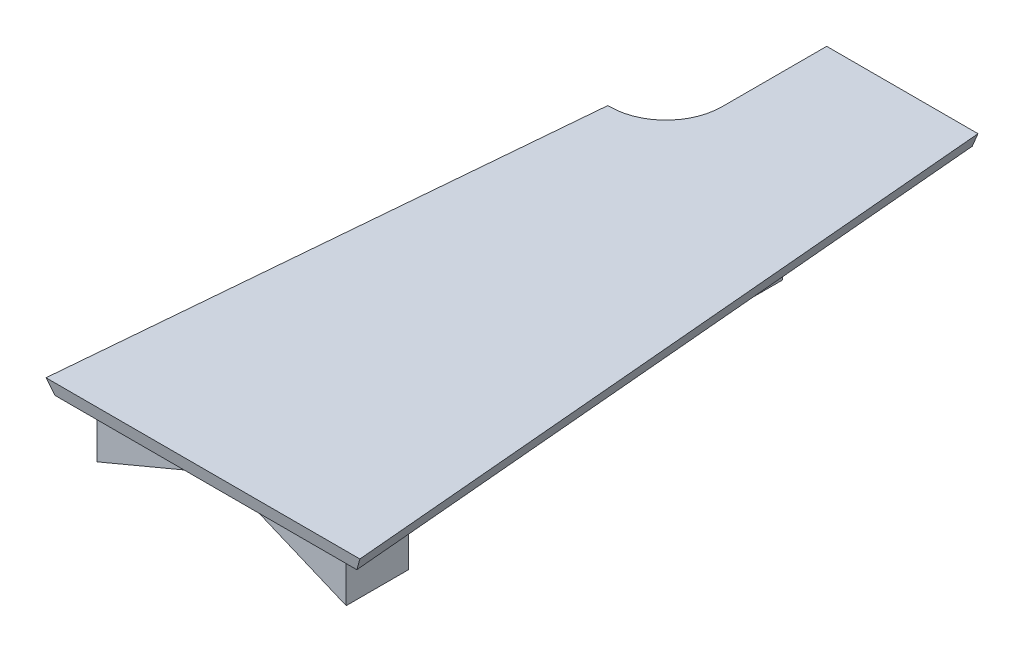
ISO-10303-21;
HEADER;
FILE_DESCRIPTION(('STEP AP214'),'2;1');
FILE_NAME('part.step','',(''),(''),'','','');
FILE_SCHEMA(('AUTOMOTIVE_DESIGN { 1 0 10303 214 1 1 1 1 }'));
ENDSEC;
DATA;
#1=APPLICATION_CONTEXT('core data for automotive mechanical design processes');
#2=APPLICATION_PROTOCOL_DEFINITION('international standard','automotive_design',2000,#1);
#3=PRODUCT_CONTEXT('',#1,'mechanical');
#4=PRODUCT('Part','Part','',(#3));
#5=PRODUCT_RELATED_PRODUCT_CATEGORY('part','',(#4));
#6=PRODUCT_DEFINITION_FORMATION('','',#4);
#7=PRODUCT_DEFINITION_CONTEXT('part definition',#1,'design');
#8=PRODUCT_DEFINITION('design','',#6,#7);
#9=PRODUCT_DEFINITION_SHAPE('','',#8);
#10=(LENGTH_UNIT() NAMED_UNIT(*) SI_UNIT(.MILLI.,.METRE.));
#11=(NAMED_UNIT(*) PLANE_ANGLE_UNIT() SI_UNIT($,.RADIAN.));
#12=(NAMED_UNIT(*) SI_UNIT($,.STERADIAN.) SOLID_ANGLE_UNIT());
#13=UNCERTAINTY_MEASURE_WITH_UNIT(LENGTH_MEASURE(1.E-05),#10,'distance_accuracy_value','');
#14=(GEOMETRIC_REPRESENTATION_CONTEXT(3) GLOBAL_UNCERTAINTY_ASSIGNED_CONTEXT((#13)) GLOBAL_UNIT_ASSIGNED_CONTEXT((#10,
#11,#12)) REPRESENTATION_CONTEXT('',''));
#15=CARTESIAN_POINT('',(0.,0.,0.));
#16=DIRECTION('',(0.,0.,1.));
#17=DIRECTION('',(1.,0.,0.));
#18=AXIS2_PLACEMENT_3D('',#15,#16,#17);
#19=CARTESIAN_POINT('',(18.0118217823983,-5.,-25.7361816822361));
#20=DIRECTION('',(0.,0.,1.));
#21=DIRECTION('',(1.,0.,0.));
#22=AXIS2_PLACEMENT_3D('',#19,#20,#21);
#23=PLANE('',#22);
#24=DIRECTION('',(0.,1.,0.));
#25=VECTOR('',#24,1.);
#26=CARTESIAN_POINT('',(18.0118217823983,-5.,-25.7361816822361));
#27=LINE('',#26,#25);
#28=CARTESIAN_POINT('',(18.0118217823983,-2.5,-25.7361816822361));
#29=VERTEX_POINT('',#28);
#30=CARTESIAN_POINT('',(18.0118217823983,0.,-25.7361816822361));
#31=VERTEX_POINT('',#30);
#32=EDGE_CURVE('E243',#29,#31,#27,.T.);
#33=ORIENTED_EDGE('',*,*,#32,.F.);
#34=DIRECTION('',(0.974370064785236,-0.224951054343862,0.));
#35=VECTOR('',#34,1.);
#36=CARTESIAN_POINT('',(18.0118217823983,-2.5,-25.7361816822361));
#37=LINE('',#36,#35);
#38=CARTESIAN_POINT('',(7.18313209668774,0.,-25.7361816822361));
#39=VERTEX_POINT('',#38);
#40=EDGE_CURVE('E382',#39,#29,#37,.T.);
#41=ORIENTED_EDGE('',*,*,#40,.F.);
#42=DIRECTION('',(1.,0.,0.));
#43=VECTOR('',#42,1.);
#44=CARTESIAN_POINT('',(18.0118217823983,0.,-25.7361816822361));
#45=LINE('',#44,#43);
#46=EDGE_CURVE('E399',#39,#31,#45,.T.);
#47=ORIENTED_EDGE('',*,*,#46,.T.);
#48=EDGE_LOOP('',(#33,#41,#47));
#49=FACE_BOUND('',#48,.T.);
#50=ADVANCED_FACE('F46',(#49),#23,.F.);
#51=CARTESIAN_POINT('',(18.0118217823983,-5.,-15.2638183177639));
#52=DIRECTION('',(0.,0.,-1.));
#53=DIRECTION('',(-1.,0.,0.));
#54=AXIS2_PLACEMENT_3D('',#51,#52,#53);
#55=PLANE('',#54);
#56=DIRECTION('',(-1.,0.,0.));
#57=VECTOR('',#56,1.);
#58=CARTESIAN_POINT('',(18.0118217823983,0.,-15.2638183177639));
#59=LINE('',#58,#57);
#60=CARTESIAN_POINT('',(18.0118217823983,0.,-15.2638183177639));
#61=VERTEX_POINT('',#60);
#62=CARTESIAN_POINT('',(7.18313209668774,0.,-15.2638183177639));
#63=VERTEX_POINT('',#62);
#64=EDGE_CURVE('E231',#61,#63,#59,.T.);
#65=ORIENTED_EDGE('',*,*,#64,.T.);
#66=DIRECTION('',(0.974370064785236,-0.224951054343862,0.));
#67=VECTOR('',#66,1.);
#68=CARTESIAN_POINT('',(18.5597857158846,-2.62650744212604,-15.2638183177639));
#69=LINE('',#68,#67);
#70=CARTESIAN_POINT('',(18.0118217823983,-2.5,-15.2638183177639));
#71=VERTEX_POINT('',#70);
#72=EDGE_CURVE('E177',#63,#71,#69,.T.);
#73=ORIENTED_EDGE('',*,*,#72,.T.);
#74=DIRECTION('',(0.,1.,0.));
#75=VECTOR('',#74,1.);
#76=CARTESIAN_POINT('',(18.0118217823983,-5.,-15.2638183177639));
#77=LINE('',#76,#75);
#78=EDGE_CURVE('E228',#71,#61,#77,.T.);
#79=ORIENTED_EDGE('',*,*,#78,.T.);
#80=EDGE_LOOP('',(#65,#73,#79));
#81=FACE_BOUND('',#80,.T.);
#82=ADVANCED_FACE('F227',(#81),#55,.F.);
#83=CARTESIAN_POINT('',(0.,0.,0.));
#84=DIRECTION('',(0.,-1.,0.));
#85=DIRECTION('',(0.,0.,-1.));
#86=AXIS2_PLACEMENT_3D('',#83,#84,#85);
#87=PLANE('',#86);
#88=DIRECTION('',(0.,0.,1.));
#89=VECTOR('',#88,1.);
#90=CARTESIAN_POINT('',(-9.73889438631091,0.,0.));
#91=LINE('',#90,#89);
#92=CARTESIAN_POINT('',(-9.73889438631091,0.,-61.5));
#93=VERTEX_POINT('',#92);
#94=CARTESIAN_POINT('',(-9.73889438631091,0.,-42.49));
#95=VERTEX_POINT('',#94);
#96=EDGE_CURVE('E335',#93,#95,#91,.T.);
#97=ORIENTED_EDGE('',*,*,#96,.F.);
#98=DIRECTION('',(-1.,0.,0.));
#99=VECTOR('',#98,1.);
#100=CARTESIAN_POINT('',(-28.5,0.,-61.5));
#101=LINE('',#100,#99);
#102=CARTESIAN_POINT('',(16.6994049090877,0.,-61.5));
#103=VERTEX_POINT('',#102);
#104=EDGE_CURVE('E199',#103,#93,#101,.T.);
#105=ORIENTED_EDGE('',*,*,#104,.F.);
#106=DIRECTION('',(0.0871557427476548,0.,0.996194698091746));
#107=VECTOR('',#106,1.);
#108=CARTESIAN_POINT('',(16.3560646475477,0.,-65.4243971470463));
#109=LINE('',#108,#107);
#110=CARTESIAN_POINT('',(27.4140197990155,0.,60.9686085958249));
#111=VERTEX_POINT('',#110);
#112=EDGE_CURVE('E313',#103,#111,#109,.T.);
#113=ORIENTED_EDGE('',*,*,#112,.T.);
#114=DIRECTION('',(1.,0.,0.));
#115=VECTOR('',#114,1.);
#116=CARTESIAN_POINT('',(-28.5,0.,60.9686085958249));
#117=LINE('',#116,#115);
#118=CARTESIAN_POINT('',(-27.4140197990155,0.,60.968608595825));
#119=VERTEX_POINT('',#118);
#120=EDGE_CURVE('E194',#119,#111,#117,.T.);
#121=ORIENTED_EDGE('',*,*,#120,.F.);
#122=DIRECTION('',(-0.0871557427476618,0.,0.996194698091745));
#123=VECTOR('',#122,1.);
#124=CARTESIAN_POINT('',(-16.3560646475468,0.,-65.4243971470465));
#125=LINE('',#124,#123);
#126=CARTESIAN_POINT('',(-19.2507211437351,0.,-32.3383219970874));
#127=VERTEX_POINT('',#126);
#128=EDGE_CURVE('E298',#127,#119,#125,.T.);
#129=ORIENTED_EDGE('',*,*,#128,.F.);
#130=CARTESIAN_POINT('',(-19.9120934717029,0.,-42.49));
#131=DIRECTION('',(0.,-1.,0.));
#132=DIRECTION('',(0.,0.,-1.));
#133=AXIS2_PLACEMENT_3D('',#130,#131,#132);
#134=CIRCLE('',#133,10.173199085392);
#135=EDGE_CURVE('E337',#95,#127,#134,.T.);
#136=ORIENTED_EDGE('',*,*,#135,.F.);
#137=EDGE_LOOP('',(#97,#105,#113,#121,#129,#136));
#138=FACE_BOUND('',#137,.T.);
#139=CARTESIAN_POINT('',(-7.18313209668769,0.,-15.2638183177639));
#140=VERTEX_POINT('',#139);
#141=CARTESIAN_POINT('',(-18.0118217823983,0.,-15.2638183177639));
#142=VERTEX_POINT('',#141);
#143=EDGE_CURVE('E405',#140,#142,#59,.T.);
#144=ORIENTED_EDGE('',*,*,#143,.F.);
#145=DIRECTION('',(0.,0.,-1.));
#146=VECTOR('',#145,1.);
#147=CARTESIAN_POINT('',(-7.18313209668769,0.,-13.7361816822361));
#148=LINE('',#147,#146);
#149=CARTESIAN_POINT('',(-7.18313209668768,0.,-25.7361816822361));
#150=VERTEX_POINT('',#149);
#151=EDGE_CURVE('E70',#140,#150,#148,.T.);
#152=ORIENTED_EDGE('',*,*,#151,.T.);
#153=CARTESIAN_POINT('',(-18.0118217823983,0.,-25.7361816822361));
#154=VERTEX_POINT('',#153);
#155=EDGE_CURVE('E400',#154,#150,#45,.T.);
#156=ORIENTED_EDGE('',*,*,#155,.F.);
#157=DIRECTION('',(0.,0.,-1.));
#158=VECTOR('',#157,1.);
#159=CARTESIAN_POINT('',(-18.0118217823983,0.,-15.2638183177639));
#160=LINE('',#159,#158);
#161=EDGE_CURVE('E388',#142,#154,#160,.T.);
#162=ORIENTED_EDGE('',*,*,#161,.F.);
#163=EDGE_LOOP('',(#144,#152,#156,#162));
#164=FACE_BOUND('',#163,.T.);
#165=DIRECTION('',(0.,0.,-1.));
#166=VECTOR('',#165,1.);
#167=CARTESIAN_POINT('',(7.18313209668774,0.,-13.7361816822361));
#168=LINE('',#167,#166);
#169=EDGE_CURVE('E389',#63,#39,#168,.T.);
#170=ORIENTED_EDGE('',*,*,#169,.F.);
#171=ORIENTED_EDGE('',*,*,#64,.F.);
#172=DIRECTION('',(0.,0.,1.));
#173=VECTOR('',#172,1.);
#174=CARTESIAN_POINT('',(18.0118217823983,0.,-15.2638183177639));
#175=LINE('',#174,#173);
#176=EDGE_CURVE('E241',#31,#61,#175,.T.);
#177=ORIENTED_EDGE('',*,*,#176,.F.);
#178=ORIENTED_EDGE('',*,*,#46,.F.);
#179=EDGE_LOOP('',(#170,#171,#177,#178));
#180=FACE_BOUND('',#179,.T.);
#181=DIRECTION('',(-1.,0.,0.));
#182=VECTOR('',#181,1.);
#183=CARTESIAN_POINT('',(22.6207372724238,0.,58.1089238494695));
#184=LINE('',#183,#182);
#185=CARTESIAN_POINT('',(0.,0.,58.1089238494695));
#186=VERTEX_POINT('',#185);
#187=CARTESIAN_POINT('',(-22.6207372724238,0.,58.1089238494695));
#188=VERTEX_POINT('',#187);
#189=EDGE_CURVE('E285',#186,#188,#184,.T.);
#190=ORIENTED_EDGE('',*,*,#189,.F.);
#191=CARTESIAN_POINT('',(22.6207372724238,0.,58.1089238494695));
#192=VERTEX_POINT('',#191);
#193=EDGE_CURVE('E286',#192,#186,#184,.T.);
#194=ORIENTED_EDGE('',*,*,#193,.F.);
#195=DIRECTION('',(0.,0.,-1.));
#196=VECTOR('',#195,1.);
#197=CARTESIAN_POINT('',(22.6207372724238,0.,58.1089238494695));
#198=LINE('',#197,#196);
#199=CARTESIAN_POINT('',(22.6207372724238,0.,46.8282933421805));
#200=VERTEX_POINT('',#199);
#201=EDGE_CURVE('E290',#192,#200,#198,.T.);
#202=ORIENTED_EDGE('',*,*,#201,.T.);
#203=DIRECTION('',(-1.,0.,0.));
#204=VECTOR('',#203,1.);
#205=CARTESIAN_POINT('',(22.6207372724238,0.,46.8282933421805));
#206=LINE('',#205,#204);
#207=CARTESIAN_POINT('',(0.,0.,46.8282933421805));
#208=VERTEX_POINT('',#207);
#209=EDGE_CURVE('E277',#200,#208,#206,.T.);
#210=ORIENTED_EDGE('',*,*,#209,.T.);
#211=CARTESIAN_POINT('',(-22.6207372724238,0.,46.8282933421805));
#212=VERTEX_POINT('',#211);
#213=EDGE_CURVE('E276',#208,#212,#206,.T.);
#214=ORIENTED_EDGE('',*,*,#213,.T.);
#215=DIRECTION('',(0.,0.,-1.));
#216=VECTOR('',#215,1.);
#217=CARTESIAN_POINT('',(-22.6207372724238,0.,58.1089238494695));
#218=LINE('',#217,#216);
#219=EDGE_CURVE('E281',#188,#212,#218,.T.);
#220=ORIENTED_EDGE('',*,*,#219,.F.);
#221=EDGE_LOOP('',(#190,#194,#202,#210,#214,#220));
#222=FACE_BOUND('',#221,.T.);
#223=ADVANCED_FACE('F331',(#138,#164,#180,#222),#87,.T.);
#224=CARTESIAN_POINT('',(22.6207372724238,-13.,46.8282933421805));
#225=DIRECTION('',(0.,0.,-1.));
#226=DIRECTION('',(-1.,0.,0.));
#227=AXIS2_PLACEMENT_3D('',#224,#225,#226);
#228=PLANE('',#227);
#229=DIRECTION('',(0.922224559507283,-0.386654706219385,0.));
#230=VECTOR('',#229,1.);
#231=CARTESIAN_POINT('',(22.6207372724238,-9.48403990586399,46.8282933421805));
#232=LINE('',#231,#230);
#233=CARTESIAN_POINT('',(22.6207372724238,-9.48403990586399,46.8282933421805));
#234=VERTEX_POINT('',#233);
#235=EDGE_CURVE('E259',#208,#234,#232,.T.);
#236=ORIENTED_EDGE('',*,*,#235,.F.);
#237=ORIENTED_EDGE('',*,*,#209,.F.);
#238=DIRECTION('',(0.,1.,0.));
#239=VECTOR('',#238,1.);
#240=CARTESIAN_POINT('',(22.6207372724238,-13.,46.8282933421805));
#241=LINE('',#240,#239);
#242=EDGE_CURVE('E295',#234,#200,#241,.T.);
#243=ORIENTED_EDGE('',*,*,#242,.F.);
#244=EDGE_LOOP('',(#236,#237,#243));
#245=FACE_BOUND('',#244,.T.);
#246=ADVANCED_FACE('F638',(#245),#228,.T.);
#247=CARTESIAN_POINT('',(22.6207372724238,-13.,58.1089238494695));
#248=DIRECTION('',(0.,0.,-1.));
#249=DIRECTION('',(-1.,0.,0.));
#250=AXIS2_PLACEMENT_3D('',#247,#248,#249);
#251=PLANE('',#250);
#252=ORIENTED_EDGE('',*,*,#193,.T.);
#253=DIRECTION('',(0.922224559507282,-0.386654706219385,0.));
#254=VECTOR('',#253,1.);
#255=CARTESIAN_POINT('',(23.8744669935864,-10.0096824860981,58.1089238494695));
#256=LINE('',#255,#254);
#257=CARTESIAN_POINT('',(22.6207372724238,-9.48403990586399,58.1089238494695));
#258=VERTEX_POINT('',#257);
#259=EDGE_CURVE('E212',#186,#258,#256,.T.);
#260=ORIENTED_EDGE('',*,*,#259,.T.);
#261=DIRECTION('',(0.,1.,0.));
#262=VECTOR('',#261,1.);
#263=CARTESIAN_POINT('',(22.6207372724238,-13.,58.1089238494695));
#264=LINE('',#263,#262);
#265=EDGE_CURVE('E299',#258,#192,#264,.T.);
#266=ORIENTED_EDGE('',*,*,#265,.T.);
#267=EDGE_LOOP('',(#252,#260,#266));
#268=FACE_BOUND('',#267,.T.);
#269=ADVANCED_FACE('F664',(#268),#251,.F.);
#270=CARTESIAN_POINT('',(-28.5,2.5,-61.5));
#271=DIRECTION('',(0.,0.,1.));
#272=DIRECTION('',(1.,0.,0.));
#273=AXIS2_PLACEMENT_3D('',#270,#271,#272);
#274=PLANE('',#273);
#275=ORIENTED_EDGE('',*,*,#104,.T.);
#276=DIRECTION('',(0.,1.,0.));
#277=VECTOR('',#276,1.);
#278=CARTESIAN_POINT('',(-9.73889438631091,-7.5,-61.5));
#279=LINE('',#278,#277);
#280=CARTESIAN_POINT('',(-9.73889438631091,2.5,-61.5));
#281=VERTEX_POINT('',#280);
#282=EDGE_CURVE('E348',#93,#281,#279,.T.);
#283=ORIENTED_EDGE('',*,*,#282,.T.);
#284=DIRECTION('',(-1.,0.,0.));
#285=VECTOR('',#284,1.);
#286=CARTESIAN_POINT('',(-28.5,2.5,-61.5));
#287=LINE('',#286,#285);
#288=CARTESIAN_POINT('',(17.7388943863118,2.5,-61.5));
#289=VERTEX_POINT('',#288);
#290=EDGE_CURVE('E206',#289,#281,#287,.T.);
#291=ORIENTED_EDGE('',*,*,#290,.F.);
#292=DIRECTION('',(-0.383930099614951,-0.92336216004862,0.));
#293=VECTOR('',#292,1.);
#294=CARTESIAN_POINT('',(10.9231740152463,-13.8919898190479,-61.5));
#295=LINE('',#294,#293);
#296=EDGE_CURVE('E201',#289,#103,#295,.T.);
#297=ORIENTED_EDGE('',*,*,#296,.T.);
#298=EDGE_LOOP('',(#275,#283,#291,#297));
#299=FACE_BOUND('',#298,.T.);
#300=ADVANCED_FACE('F48',(#299),#274,.F.);
#301=CARTESIAN_POINT('',(0.,2.5,0.));
#302=DIRECTION('',(0.,-1.,0.));
#303=DIRECTION('',(0.,0.,-1.));
#304=AXIS2_PLACEMENT_3D('',#301,#302,#303);
#305=PLANE('',#304);
#306=ORIENTED_EDGE('',*,*,#290,.T.);
#307=DIRECTION('',(0.,0.,-1.));
#308=VECTOR('',#307,1.);
#309=CARTESIAN_POINT('',(-9.73889438631091,2.5,-61.5));
#310=LINE('',#309,#308);
#311=CARTESIAN_POINT('',(-9.73889438631091,2.5,-42.49));
#312=VERTEX_POINT('',#311);
#313=EDGE_CURVE('E770',#312,#281,#310,.T.);
#314=ORIENTED_EDGE('',*,*,#313,.F.);
#315=CARTESIAN_POINT('',(-19.9120934717029,2.5,-42.49));
#316=DIRECTION('',(0.,1.,0.));
#317=DIRECTION('',(0.,0.,1.));
#318=AXIS2_PLACEMENT_3D('',#315,#316,#317);
#319=CIRCLE('',#318,10.173199085392);
#320=CARTESIAN_POINT('',(-19.9120934717029,2.5,-32.316800914608));
#321=VERTEX_POINT('',#320);
#322=EDGE_CURVE('E187',#321,#312,#319,.T.);
#323=ORIENTED_EDGE('',*,*,#322,.F.);
#324=DIRECTION('',(1.,0.,0.));
#325=VECTOR('',#324,1.);
#326=CARTESIAN_POINT('',(-19.9120934717029,2.5,-32.316800914608));
#327=LINE('',#326,#325);
#328=CARTESIAN_POINT('',(-20.2920934717029,2.5,-32.316800914608));
#329=VERTEX_POINT('',#328);
#330=EDGE_CURVE('E172',#329,#321,#327,.T.);
#331=ORIENTED_EDGE('',*,*,#330,.F.);
#332=DIRECTION('',(0.0871557427476617,0.,-0.996194698091745));
#333=VECTOR('',#332,1.);
#334=CARTESIAN_POINT('',(-28.5,2.5,61.5));
#335=LINE('',#334,#333);
#336=CARTESIAN_POINT('',(-28.5,2.5,61.5));
#337=VERTEX_POINT('',#336);
#338=EDGE_CURVE('E183',#337,#329,#335,.T.);
#339=ORIENTED_EDGE('',*,*,#338,.F.);
#340=DIRECTION('',(1.,0.,0.));
#341=VECTOR('',#340,1.);
#342=CARTESIAN_POINT('',(-28.5,2.5,61.5));
#343=LINE('',#342,#341);
#344=CARTESIAN_POINT('',(28.5,2.5,61.5));
#345=VERTEX_POINT('',#344);
#346=EDGE_CURVE('E209',#337,#345,#343,.T.);
#347=ORIENTED_EDGE('',*,*,#346,.T.);
#348=DIRECTION('',(0.0871557427476548,0.,0.996194698091746));
#349=VECTOR('',#348,1.);
#350=CARTESIAN_POINT('',(28.5,2.5,61.5));
#351=LINE('',#350,#349);
#352=EDGE_CURVE('E195',#289,#345,#351,.T.);
#353=ORIENTED_EDGE('',*,*,#352,.F.);
#354=EDGE_LOOP('',(#306,#314,#323,#331,#339,#347,#353));
#355=FACE_BOUND('',#354,.T.);
#356=ADVANCED_FACE('F181',(#355),#305,.F.);
#357=CARTESIAN_POINT('',(-28.5,0.,60.9686085958249));
#358=DIRECTION('',(0.,0.207911690817761,-0.978147600733805));
#359=DIRECTION('',(0.,0.978147600733805,0.207911690817761));
#360=AXIS2_PLACEMENT_3D('',#357,#358,#359);
#361=PLANE('',#360);
#362=ORIENTED_EDGE('',*,*,#346,.F.);
#363=DIRECTION('',(0.391062348992312,-0.900252022637708,-0.191354474568356));
#364=VECTOR('',#363,1.);
#365=CARTESIAN_POINT('',(-27.580098491385,0.382324401998462,61.0498741561563));
#366=LINE('',#365,#364);
#367=EDGE_CURVE('E192',#337,#119,#366,.T.);
#368=ORIENTED_EDGE('',*,*,#367,.T.);
#369=ORIENTED_EDGE('',*,*,#120,.T.);
#370=DIRECTION('',(0.391062348992305,0.900252022637711,0.191354474568357));
#371=VECTOR('',#370,1.);
#372=CARTESIAN_POINT('',(18.8631021258203,-19.6847918254948,56.7844769282076));
#373=LINE('',#372,#371);
#374=EDGE_CURVE('E316',#111,#345,#373,.T.);
#375=ORIENTED_EDGE('',*,*,#374,.T.);
#376=EDGE_LOOP('',(#362,#368,#369,#375));
#377=FACE_BOUND('',#376,.T.);
#378=ADVANCED_FACE('F724',(#377),#361,.F.);
#379=CARTESIAN_POINT('',(16.3560646475477,0.,-65.4243971470463));
#380=DIRECTION('',(-0.920363891963226,0.382683432365086,0.0805214068653775));
#381=DIRECTION('',(-0.383930099614951,-0.92336216004862,0.));
#382=AXIS2_PLACEMENT_3D('',#379,#380,#381);
#383=PLANE('',#382);
#384=ORIENTED_EDGE('',*,*,#352,.T.);
#385=ORIENTED_EDGE('',*,*,#374,.F.);
#386=ORIENTED_EDGE('',*,*,#112,.F.);
#387=ORIENTED_EDGE('',*,*,#296,.F.);
#388=EDGE_LOOP('',(#384,#385,#386,#387));
#389=FACE_BOUND('',#388,.T.);
#390=ADVANCED_FACE('F717',(#389),#383,.F.);
#391=CARTESIAN_POINT('',(-17.3876580343312,2.5,-65.5146498737584));
#392=DIRECTION('',(0.920363891963223,0.382683432365092,0.0805214068653837));
#393=DIRECTION('',(-0.383930099614957,0.923362160048618,0.));
#394=AXIS2_PLACEMENT_3D('',#391,#392,#393);
#395=PLANE('',#394);
#396=DIRECTION('',(0.383930099614957,-0.923362160048618,0.));
#397=VECTOR('',#396,1.);
#398=CARTESIAN_POINT('',(-19.8639729459059,1.47035868285005,-32.316800914608));
#399=LINE('',#398,#397);
#400=CARTESIAN_POINT('',(-19.9120934717029,1.58608983465903,-32.316800914608));
#401=VERTEX_POINT('',#400);
#402=EDGE_CURVE('E55',#329,#401,#399,.T.);
#403=ORIENTED_EDGE('',*,*,#402,.T.);
#404=CARTESIAN_POINT('',(-19.9120934717029,3.72665886220946,-42.49));
#405=DIRECTION('',(0.920363891963223,0.382683432365092,0.0805214068653837));
#406=DIRECTION('',(-0.381227206369655,0.923879532511286,-0.0333530587850041));
#407=AXIS2_PLACEMENT_3D('',#404,#405,#406);
#408=ELLIPSE('',#407,26.5838503185748,10.173199085392);
#409=EDGE_CURVE('E11',#401,#127,#408,.T.);
#410=ORIENTED_EDGE('',*,*,#409,.T.);
#411=ORIENTED_EDGE('',*,*,#128,.T.);
#412=ORIENTED_EDGE('',*,*,#367,.F.);
#413=ORIENTED_EDGE('',*,*,#338,.T.);
#414=EDGE_LOOP('',(#403,#410,#411,#412,#413));
#415=FACE_BOUND('',#414,.T.);
#416=ADVANCED_FACE('F190',(#415),#395,.F.);
#417=DIRECTION('',(0.922224559507283,0.386654706219385,0.));
#418=VECTOR('',#417,1.);
#419=CARTESIAN_POINT('',(0.,0.,46.8282933421805));
#420=LINE('',#419,#418);
#421=CARTESIAN_POINT('',(-22.6207372724238,-9.48403990586399,46.8282933421805));
#422=VERTEX_POINT('',#421);
#423=EDGE_CURVE('E255',#422,#208,#420,.T.);
#424=ORIENTED_EDGE('',*,*,#423,.F.);
#425=DIRECTION('',(0.,1.,0.));
#426=VECTOR('',#425,1.);
#427=CARTESIAN_POINT('',(-22.6207372724238,-13.,46.8282933421805));
#428=LINE('',#427,#426);
#429=EDGE_CURVE('E294',#422,#212,#428,.T.);
#430=ORIENTED_EDGE('',*,*,#429,.T.);
#431=ORIENTED_EDGE('',*,*,#213,.F.);
#432=EDGE_LOOP('',(#424,#430,#431));
#433=FACE_BOUND('',#432,.T.);
#434=ADVANCED_FACE('F667',(#433),#228,.T.);
#435=CARTESIAN_POINT('',(22.6207372724238,-13.,58.1089238494695));
#436=DIRECTION('',(1.,0.,0.));
#437=DIRECTION('',(0.,0.,-1.));
#438=AXIS2_PLACEMENT_3D('',#435,#436,#437);
#439=PLANE('',#438);
#440=DIRECTION('',(0.,0.,-1.));
#441=VECTOR('',#440,1.);
#442=CARTESIAN_POINT('',(22.6207372724238,-9.48403990586399,66.8282933421805));
#443=LINE('',#442,#441);
#444=EDGE_CURVE('E263',#258,#234,#443,.T.);
#445=ORIENTED_EDGE('',*,*,#444,.T.);
#446=ORIENTED_EDGE('',*,*,#242,.T.);
#447=ORIENTED_EDGE('',*,*,#201,.F.);
#448=ORIENTED_EDGE('',*,*,#265,.F.);
#449=EDGE_LOOP('',(#445,#446,#447,#448));
#450=FACE_BOUND('',#449,.T.);
#451=ADVANCED_FACE('F695',(#450),#439,.T.);
#452=DIRECTION('',(0.,1.,0.));
#453=VECTOR('',#452,1.);
#454=CARTESIAN_POINT('',(-22.6207372724238,-13.,58.1089238494695));
#455=LINE('',#454,#453);
#456=CARTESIAN_POINT('',(-22.6207372724238,-9.48403990586399,58.1089238494695));
#457=VERTEX_POINT('',#456);
#458=EDGE_CURVE('E302',#457,#188,#455,.T.);
#459=ORIENTED_EDGE('',*,*,#458,.F.);
#460=DIRECTION('',(0.922224559507282,0.386654706219385,0.));
#461=VECTOR('',#460,1.);
#462=CARTESIAN_POINT('',(14.6033228743471,6.12263407821652,58.1089238494695));
#463=LINE('',#462,#461);
#464=EDGE_CURVE('E267',#457,#186,#463,.T.);
#465=ORIENTED_EDGE('',*,*,#464,.T.);
#466=ORIENTED_EDGE('',*,*,#189,.T.);
#467=EDGE_LOOP('',(#459,#465,#466));
#468=FACE_BOUND('',#467,.T.);
#469=ADVANCED_FACE('F678',(#468),#251,.F.);
#470=CARTESIAN_POINT('',(-22.6207372724238,-13.,58.1089238494695));
#471=DIRECTION('',(1.,0.,0.));
#472=DIRECTION('',(0.,0.,-1.));
#473=AXIS2_PLACEMENT_3D('',#470,#471,#472);
#474=PLANE('',#473);
#475=ORIENTED_EDGE('',*,*,#429,.F.);
#476=DIRECTION('',(0.,0.,-1.));
#477=VECTOR('',#476,1.);
#478=CARTESIAN_POINT('',(-22.6207372724238,-9.48403990586399,66.8282933421805));
#479=LINE('',#478,#477);
#480=EDGE_CURVE('E262',#457,#422,#479,.T.);
#481=ORIENTED_EDGE('',*,*,#480,.F.);
#482=ORIENTED_EDGE('',*,*,#458,.T.);
#483=ORIENTED_EDGE('',*,*,#219,.T.);
#484=EDGE_LOOP('',(#475,#481,#482,#483));
#485=FACE_BOUND('',#484,.T.);
#486=ADVANCED_FACE('F655',(#485),#474,.F.);
#487=CARTESIAN_POINT('',(22.6207372724238,-9.48403990586399,66.8282933421805));
#488=DIRECTION('',(0.386654706219385,0.922224559507283,0.));
#489=DIRECTION('',(-0.922224559507283,0.386654706219385,0.));
#490=AXIS2_PLACEMENT_3D('',#487,#488,#489);
#491=PLANE('',#490);
#492=DIRECTION('',(0.,0.,-1.));
#493=VECTOR('',#492,1.);
#494=CARTESIAN_POINT('',(0.,0.,66.8282933421805));
#495=LINE('',#494,#493);
#496=EDGE_CURVE('E268',#186,#208,#495,.T.);
#497=ORIENTED_EDGE('',*,*,#496,.T.);
#498=ORIENTED_EDGE('',*,*,#235,.T.);
#499=ORIENTED_EDGE('',*,*,#444,.F.);
#500=ORIENTED_EDGE('',*,*,#259,.F.);
#501=EDGE_LOOP('',(#497,#498,#499,#500));
#502=FACE_BOUND('',#501,.T.);
#503=ADVANCED_FACE('F646',(#502),#491,.F.);
#504=CARTESIAN_POINT('',(0.,0.,66.8282933421805));
#505=DIRECTION('',(-0.386654706219385,0.922224559507283,0.));
#506=DIRECTION('',(-0.922224559507283,-0.386654706219385,0.));
#507=AXIS2_PLACEMENT_3D('',#504,#505,#506);
#508=PLANE('',#507);
#509=ORIENTED_EDGE('',*,*,#480,.T.);
#510=ORIENTED_EDGE('',*,*,#423,.T.);
#511=ORIENTED_EDGE('',*,*,#496,.F.);
#512=ORIENTED_EDGE('',*,*,#464,.F.);
#513=EDGE_LOOP('',(#509,#510,#511,#512));
#514=FACE_BOUND('',#513,.T.);
#515=ADVANCED_FACE('F431',(#514),#508,.F.);
#516=CARTESIAN_POINT('',(-18.0118217823983,-5.,-15.2638183177639));
#517=DIRECTION('',(1.,0.,0.));
#518=DIRECTION('',(0.,0.,-1.));
#519=AXIS2_PLACEMENT_3D('',#516,#517,#518);
#520=PLANE('',#519);
#521=DIRECTION('',(0.,1.,0.));
#522=VECTOR('',#521,1.);
#523=CARTESIAN_POINT('',(-18.0118217823983,-5.,-25.7361816822361));
#524=LINE('',#523,#522);
#525=CARTESIAN_POINT('',(-18.0118217823983,-2.5,-25.7361816822361));
#526=VERTEX_POINT('',#525);
#527=EDGE_CURVE('E248',#526,#154,#524,.T.);
#528=ORIENTED_EDGE('',*,*,#527,.F.);
#529=DIRECTION('',(0.,0.,-1.));
#530=VECTOR('',#529,1.);
#531=CARTESIAN_POINT('',(-18.0118217823983,-2.5,-13.7361816822361));
#532=LINE('',#531,#530);
#533=CARTESIAN_POINT('',(-18.0118217823983,-2.5,-15.2638183177639));
#534=VERTEX_POINT('',#533);
#535=EDGE_CURVE('E385',#534,#526,#532,.T.);
#536=ORIENTED_EDGE('',*,*,#535,.F.);
#537=DIRECTION('',(0.,1.,0.));
#538=VECTOR('',#537,1.);
#539=CARTESIAN_POINT('',(-18.0118217823983,-5.,-15.2638183177639));
#540=LINE('',#539,#538);
#541=EDGE_CURVE('E244',#534,#142,#540,.T.);
#542=ORIENTED_EDGE('',*,*,#541,.T.);
#543=ORIENTED_EDGE('',*,*,#161,.T.);
#544=EDGE_LOOP('',(#528,#536,#542,#543));
#545=FACE_BOUND('',#544,.T.);
#546=ADVANCED_FACE('F418',(#545),#520,.F.);
#547=ORIENTED_EDGE('',*,*,#155,.T.);
#548=DIRECTION('',(0.974370064785236,0.224951054343861,0.));
#549=VECTOR('',#548,1.);
#550=CARTESIAN_POINT('',(-7.18313209668768,0.,-25.7361816822361));
#551=LINE('',#550,#549);
#552=EDGE_CURVE('E373',#526,#150,#551,.T.);
#553=ORIENTED_EDGE('',*,*,#552,.F.);
#554=ORIENTED_EDGE('',*,*,#527,.T.);
#555=EDGE_LOOP('',(#547,#553,#554));
#556=FACE_BOUND('',#555,.T.);
#557=ADVANCED_FACE('F423',(#556),#23,.F.);
#558=CARTESIAN_POINT('',(18.0118217823983,-5.,-15.2638183177639));
#559=DIRECTION('',(-1.,0.,0.));
#560=DIRECTION('',(0.,0.,1.));
#561=AXIS2_PLACEMENT_3D('',#558,#559,#560);
#562=PLANE('',#561);
#563=ORIENTED_EDGE('',*,*,#78,.F.);
#564=DIRECTION('',(0.,0.,-1.));
#565=VECTOR('',#564,1.);
#566=CARTESIAN_POINT('',(18.0118217823983,-2.5,-13.7361816822361));
#567=LINE('',#566,#565);
#568=EDGE_CURVE('E238',#71,#29,#567,.T.);
#569=ORIENTED_EDGE('',*,*,#568,.T.);
#570=ORIENTED_EDGE('',*,*,#32,.T.);
#571=ORIENTED_EDGE('',*,*,#176,.T.);
#572=EDGE_LOOP('',(#563,#569,#570,#571));
#573=FACE_BOUND('',#572,.T.);
#574=ADVANCED_FACE('F236',(#573),#562,.F.);
#575=ORIENTED_EDGE('',*,*,#541,.F.);
#576=DIRECTION('',(0.974370064785236,0.224951054343861,0.));
#577=VECTOR('',#576,1.);
#578=CARTESIAN_POINT('',(15.6409542475349,5.26935552838426,-15.2638183177639));
#579=LINE('',#578,#577);
#580=EDGE_CURVE('E219',#534,#140,#579,.T.);
#581=ORIENTED_EDGE('',*,*,#580,.T.);
#582=ORIENTED_EDGE('',*,*,#143,.T.);
#583=EDGE_LOOP('',(#575,#581,#582));
#584=FACE_BOUND('',#583,.T.);
#585=ADVANCED_FACE('F413',(#584),#55,.F.);
#586=CARTESIAN_POINT('',(18.0118217823983,-2.5,-13.7361816822361));
#587=DIRECTION('',(0.224951054343862,0.974370064785236,0.));
#588=DIRECTION('',(-0.974370064785236,0.224951054343862,0.));
#589=AXIS2_PLACEMENT_3D('',#586,#587,#588);
#590=PLANE('',#589);
#591=ORIENTED_EDGE('',*,*,#169,.T.);
#592=ORIENTED_EDGE('',*,*,#40,.T.);
#593=ORIENTED_EDGE('',*,*,#568,.F.);
#594=ORIENTED_EDGE('',*,*,#72,.F.);
#595=EDGE_LOOP('',(#591,#592,#593,#594));
#596=FACE_BOUND('',#595,.T.);
#597=ADVANCED_FACE('F443',(#596),#590,.F.);
#598=CARTESIAN_POINT('',(-7.18313209668769,0.,-13.7361816822361));
#599=DIRECTION('',(-0.224951054343861,0.974370064785236,0.));
#600=DIRECTION('',(-0.974370064785236,-0.224951054343861,0.));
#601=AXIS2_PLACEMENT_3D('',#598,#599,#600);
#602=PLANE('',#601);
#603=ORIENTED_EDGE('',*,*,#535,.T.);
#604=ORIENTED_EDGE('',*,*,#552,.T.);
#605=ORIENTED_EDGE('',*,*,#151,.F.);
#606=ORIENTED_EDGE('',*,*,#580,.F.);
#607=EDGE_LOOP('',(#603,#604,#605,#606));
#608=FACE_BOUND('',#607,.T.);
#609=ADVANCED_FACE('F421',(#608),#602,.F.);
#610=CARTESIAN_POINT('',(-19.9120934717029,-7.5,-32.316800914608));
#611=DIRECTION('',(0.,0.,1.));
#612=DIRECTION('',(1.,0.,0.));
#613=AXIS2_PLACEMENT_3D('',#610,#611,#612);
#614=PLANE('',#613);
#615=ORIENTED_EDGE('',*,*,#330,.T.);
#616=DIRECTION('',(0.,1.,0.));
#617=VECTOR('',#616,1.);
#618=CARTESIAN_POINT('',(-19.9120934717029,-7.5,-32.316800914608));
#619=LINE('',#618,#617);
#620=EDGE_CURVE('E62',#401,#321,#619,.T.);
#621=ORIENTED_EDGE('',*,*,#620,.F.);
#622=ORIENTED_EDGE('',*,*,#402,.F.);
#623=EDGE_LOOP('',(#615,#621,#622));
#624=FACE_BOUND('',#623,.T.);
#625=ADVANCED_FACE('F171',(#624),#614,.F.);
#626=CARTESIAN_POINT('',(-9.73889438631091,-7.5,-61.5));
#627=DIRECTION('',(1.,0.,0.));
#628=DIRECTION('',(0.,0.,-1.));
#629=AXIS2_PLACEMENT_3D('',#626,#627,#628);
#630=PLANE('',#629);
#631=ORIENTED_EDGE('',*,*,#96,.T.);
#632=DIRECTION('',(0.,1.,0.));
#633=VECTOR('',#632,1.);
#634=CARTESIAN_POINT('',(-9.73889438631091,-7.5,-42.49));
#635=LINE('',#634,#633);
#636=EDGE_CURVE('E775',#95,#312,#635,.T.);
#637=ORIENTED_EDGE('',*,*,#636,.T.);
#638=ORIENTED_EDGE('',*,*,#313,.T.);
#639=ORIENTED_EDGE('',*,*,#282,.F.);
#640=EDGE_LOOP('',(#631,#637,#638,#639));
#641=FACE_BOUND('',#640,.T.);
#642=ADVANCED_FACE('F509',(#641),#630,.F.);
#643=CARTESIAN_POINT('',(-19.9120934717029,-7.5,-42.49));
#644=DIRECTION('',(0.,1.,0.));
#645=DIRECTION('',(0.,0.,1.));
#646=AXIS2_PLACEMENT_3D('',#643,#644,#645);
#647=CYLINDRICAL_SURFACE('',#646,10.173199085392);
#648=ORIENTED_EDGE('',*,*,#135,.T.);
#649=ORIENTED_EDGE('',*,*,#409,.F.);
#650=ORIENTED_EDGE('',*,*,#620,.T.);
#651=ORIENTED_EDGE('',*,*,#322,.T.);
#652=ORIENTED_EDGE('',*,*,#636,.F.);
#653=EDGE_LOOP('',(#648,#649,#650,#651,#652));
#654=FACE_BOUND('',#653,.T.);
#655=ADVANCED_FACE('F510',(#654),#647,.F.);
#656=CLOSED_SHELL('',(#50,#82,#223,#246,#269,#300,#356,#378,#390,#416,#434,#451,#469,#486,#503,
#515,#546,#557,#574,#585,#597,#609,#625,#642,#655));
#657=CARTESIAN_POINT('',(12.597476939543,-0.5,-20.5));
#658=DIRECTION('',(0.,1.,0.));
#659=DIRECTION('',(0.,0.,1.));
#660=AXIS2_PLACEMENT_3D('',#657,#658,#659);
#661=CYLINDRICAL_SURFACE('',#660,3.1);
#662=CARTESIAN_POINT('',(12.597476939543,-0.5,-20.5));
#663=DIRECTION('',(0.,-1.,0.));
#664=DIRECTION('',(0.,0.,-1.));
#665=AXIS2_PLACEMENT_3D('',#662,#663,#664);
#666=CIRCLE('',#665,3.1);
#667=CARTESIAN_POINT('',(12.597476939543,-0.5,-23.6));
#668=VERTEX_POINT('',#667);
#669=EDGE_CURVE('E368',#668,#668,#666,.T.);
#670=ORIENTED_EDGE('',*,*,#669,.T.);
#671=EDGE_LOOP('',(#670));
#672=FACE_BOUND('',#671,.T.);
#673=CARTESIAN_POINT('',(12.597476939543,1.65,-20.5));
#674=DIRECTION('',(0.,-1.,0.));
#675=DIRECTION('',(0.,0.,-1.));
#676=AXIS2_PLACEMENT_3D('',#673,#674,#675);
#677=CIRCLE('',#676,3.1);
#678=CARTESIAN_POINT('',(12.597476939543,1.65,-23.6));
#679=VERTEX_POINT('',#678);
#680=EDGE_CURVE('E364',#679,#679,#677,.T.);
#681=ORIENTED_EDGE('',*,*,#680,.F.);
#682=EDGE_LOOP('',(#681));
#683=FACE_BOUND('',#682,.T.);
#684=ADVANCED_FACE('F466',(#672,#683),#661,.F.);
#685=CARTESIAN_POINT('',(12.597476939543,-0.5,-20.5));
#686=DIRECTION('',(0.,-1.,0.));
#687=DIRECTION('',(0.,0.,-1.));
#688=AXIS2_PLACEMENT_3D('',#685,#686,#687);
#689=PLANE('',#688);
#690=ORIENTED_EDGE('',*,*,#669,.F.);
#691=EDGE_LOOP('',(#690));
#692=FACE_BOUND('',#691,.T.);
#693=ADVANCED_FACE('F469',(#692),#689,.F.);
#694=CARTESIAN_POINT('',(12.597476939543,1.65,-20.5));
#695=DIRECTION('',(0.,-1.,0.));
#696=DIRECTION('',(0.,0.,-1.));
#697=AXIS2_PLACEMENT_3D('',#694,#695,#696);
#698=PLANE('',#697);
#699=ORIENTED_EDGE('',*,*,#680,.T.);
#700=EDGE_LOOP('',(#699));
#701=FACE_BOUND('',#700,.T.);
#702=ADVANCED_FACE('F474',(#701),#698,.T.);
#703=CLOSED_SHELL('',(#684,#693,#702));
#704=CARTESIAN_POINT('',(-12.597476939543,-0.5,-20.5));
#705=DIRECTION('',(0.,1.,0.));
#706=DIRECTION('',(0.,0.,1.));
#707=AXIS2_PLACEMENT_3D('',#704,#705,#706);
#708=CYLINDRICAL_SURFACE('',#707,3.1);
#709=CARTESIAN_POINT('',(-12.597476939543,-0.5,-20.5));
#710=DIRECTION('',(0.,-1.,0.));
#711=DIRECTION('',(0.,0.,-1.));
#712=AXIS2_PLACEMENT_3D('',#709,#710,#711);
#713=CIRCLE('',#712,3.1);
#714=CARTESIAN_POINT('',(-12.597476939543,-0.5,-23.6));
#715=VERTEX_POINT('',#714);
#716=EDGE_CURVE('E359',#715,#715,#713,.T.);
#717=ORIENTED_EDGE('',*,*,#716,.T.);
#718=EDGE_LOOP('',(#717));
#719=FACE_BOUND('',#718,.T.);
#720=CARTESIAN_POINT('',(-12.597476939543,1.65,-20.5));
#721=DIRECTION('',(0.,-1.,0.));
#722=DIRECTION('',(0.,0.,-1.));
#723=AXIS2_PLACEMENT_3D('',#720,#721,#722);
#724=CIRCLE('',#723,3.1);
#725=CARTESIAN_POINT('',(-12.597476939543,1.65,-23.6));
#726=VERTEX_POINT('',#725);
#727=EDGE_CURVE('E369',#726,#726,#724,.T.);
#728=ORIENTED_EDGE('',*,*,#727,.F.);
#729=EDGE_LOOP('',(#728));
#730=FACE_BOUND('',#729,.T.);
#731=ADVANCED_FACE('F461',(#719,#730),#708,.F.);
#732=CARTESIAN_POINT('',(-12.597476939543,-0.5,-20.5));
#733=DIRECTION('',(0.,-1.,0.));
#734=DIRECTION('',(0.,0.,-1.));
#735=AXIS2_PLACEMENT_3D('',#732,#733,#734);
#736=PLANE('',#735);
#737=ORIENTED_EDGE('',*,*,#716,.F.);
#738=EDGE_LOOP('',(#737));
#739=FACE_BOUND('',#738,.T.);
#740=ADVANCED_FACE('F455',(#739),#736,.F.);
#741=CARTESIAN_POINT('',(-12.597476939543,1.65,-20.5));
#742=DIRECTION('',(0.,-1.,0.));
#743=DIRECTION('',(0.,0.,-1.));
#744=AXIS2_PLACEMENT_3D('',#741,#742,#743);
#745=PLANE('',#744);
#746=ORIENTED_EDGE('',*,*,#727,.T.);
#747=EDGE_LOOP('',(#746));
#748=FACE_BOUND('',#747,.T.);
#749=ADVANCED_FACE('F452',(#748),#745,.T.);
#750=CLOSED_SHELL('',(#731,#740,#749));
#751=CARTESIAN_POINT('',(-16.9655529543178,-3.592019952932,52.468608595825));
#752=DIRECTION('',(0.,-1.,0.));
#753=DIRECTION('',(0.,0.,-1.));
#754=AXIS2_PLACEMENT_3D('',#751,#752,#753);
#755=CYLINDRICAL_SURFACE('',#754,3.1);
#756=CARTESIAN_POINT('',(-16.9655529543178,-3.592019952932,52.468608595825));
#757=DIRECTION('',(0.,1.,0.));
#758=DIRECTION('',(0.,0.,1.));
#759=AXIS2_PLACEMENT_3D('',#756,#757,#758);
#760=CIRCLE('',#759,3.1);
#761=CARTESIAN_POINT('',(-16.9655529543178,-3.592019952932,55.568608595825));
#762=VERTEX_POINT('',#761);
#763=EDGE_CURVE('E356',#762,#762,#760,.T.);
#764=ORIENTED_EDGE('',*,*,#763,.T.);
#765=EDGE_LOOP('',(#764));
#766=FACE_BOUND('',#765,.T.);
#767=CARTESIAN_POINT('',(-16.9655529543178,-5.742019952932,52.468608595825));
#768=DIRECTION('',(0.,1.,0.));
#769=DIRECTION('',(0.,0.,1.));
#770=AXIS2_PLACEMENT_3D('',#767,#768,#769);
#771=CIRCLE('',#770,3.1);
#772=CARTESIAN_POINT('',(-16.9655529543178,-5.742019952932,55.568608595825));
#773=VERTEX_POINT('',#772);
#774=EDGE_CURVE('E352',#773,#773,#771,.T.);
#775=ORIENTED_EDGE('',*,*,#774,.F.);
#776=EDGE_LOOP('',(#775));
#777=FACE_BOUND('',#776,.T.);
#778=ADVANCED_FACE('F493',(#766,#777),#755,.F.);
#779=CARTESIAN_POINT('',(-16.9655529543178,-3.592019952932,52.468608595825));
#780=DIRECTION('',(0.,1.,0.));
#781=DIRECTION('',(0.,0.,1.));
#782=AXIS2_PLACEMENT_3D('',#779,#780,#781);
#783=PLANE('',#782);
#784=ORIENTED_EDGE('',*,*,#763,.F.);
#785=EDGE_LOOP('',(#784));
#786=FACE_BOUND('',#785,.T.);
#787=ADVANCED_FACE('F496',(#786),#783,.F.);
#788=CARTESIAN_POINT('',(-16.9655529543178,-5.742019952932,52.468608595825));
#789=DIRECTION('',(0.,1.,0.));
#790=DIRECTION('',(0.,0.,1.));
#791=AXIS2_PLACEMENT_3D('',#788,#789,#790);
#792=PLANE('',#791);
#793=ORIENTED_EDGE('',*,*,#774,.T.);
#794=EDGE_LOOP('',(#793));
#795=FACE_BOUND('',#794,.T.);
#796=ADVANCED_FACE('F502',(#795),#792,.T.);
#797=CLOSED_SHELL('',(#778,#787,#796));
#798=CARTESIAN_POINT('',(16.9655529543178,-3.592019952932,52.468608595825));
#799=DIRECTION('',(0.,-1.,0.));
#800=DIRECTION('',(0.,0.,-1.));
#801=AXIS2_PLACEMENT_3D('',#798,#799,#800);
#802=CYLINDRICAL_SURFACE('',#801,3.1);
#803=CARTESIAN_POINT('',(16.9655529543178,-3.592019952932,52.468608595825));
#804=DIRECTION('',(0.,1.,0.));
#805=DIRECTION('',(0.,0.,1.));
#806=AXIS2_PLACEMENT_3D('',#803,#804,#805);
#807=CIRCLE('',#806,3.1);
#808=CARTESIAN_POINT('',(16.9655529543178,-3.592019952932,55.568608595825));
#809=VERTEX_POINT('',#808);
#810=EDGE_CURVE('E341',#809,#809,#807,.T.);
#811=ORIENTED_EDGE('',*,*,#810,.T.);
#812=EDGE_LOOP('',(#811));
#813=FACE_BOUND('',#812,.T.);
#814=CARTESIAN_POINT('',(16.9655529543178,-5.742019952932,52.468608595825));
#815=DIRECTION('',(0.,1.,0.));
#816=DIRECTION('',(0.,0.,1.));
#817=AXIS2_PLACEMENT_3D('',#814,#815,#816);
#818=CIRCLE('',#817,3.1);
#819=CARTESIAN_POINT('',(16.9655529543178,-5.742019952932,55.568608595825));
#820=VERTEX_POINT('',#819);
#821=EDGE_CURVE('E346',#820,#820,#818,.T.);
#822=ORIENTED_EDGE('',*,*,#821,.F.);
#823=EDGE_LOOP('',(#822));
#824=FACE_BOUND('',#823,.T.);
#825=ADVANCED_FACE('F488',(#813,#824),#802,.F.);
#826=CARTESIAN_POINT('',(16.9655529543178,-3.592019952932,52.468608595825));
#827=DIRECTION('',(0.,1.,0.));
#828=DIRECTION('',(0.,0.,1.));
#829=AXIS2_PLACEMENT_3D('',#826,#827,#828);
#830=PLANE('',#829);
#831=ORIENTED_EDGE('',*,*,#810,.F.);
#832=EDGE_LOOP('',(#831));
#833=FACE_BOUND('',#832,.T.);
#834=ADVANCED_FACE('F482',(#833),#830,.F.);
#835=CARTESIAN_POINT('',(16.9655529543178,-5.742019952932,52.468608595825));
#836=DIRECTION('',(0.,1.,0.));
#837=DIRECTION('',(0.,0.,1.));
#838=AXIS2_PLACEMENT_3D('',#835,#836,#837);
#839=PLANE('',#838);
#840=ORIENTED_EDGE('',*,*,#821,.T.);
#841=EDGE_LOOP('',(#840));
#842=FACE_BOUND('',#841,.T.);
#843=ADVANCED_FACE('F479',(#842),#839,.T.);
#844=CLOSED_SHELL('',(#825,#834,#843));
#845=ORIENTED_CLOSED_SHELL('',*,#703,.T.);
#846=ORIENTED_CLOSED_SHELL('',*,#750,.T.);
#847=ORIENTED_CLOSED_SHELL('',*,#797,.T.);
#848=ORIENTED_CLOSED_SHELL('',*,#844,.T.);
#849=BREP_WITH_VOIDS('B2',#656,(#845,#846,#847,#848));
#850=ADVANCED_BREP_SHAPE_REPRESENTATION('',(#18,#849),#14);
#851=SHAPE_DEFINITION_REPRESENTATION(#9,#850);
ENDSEC;
END-ISO-10303-21;
